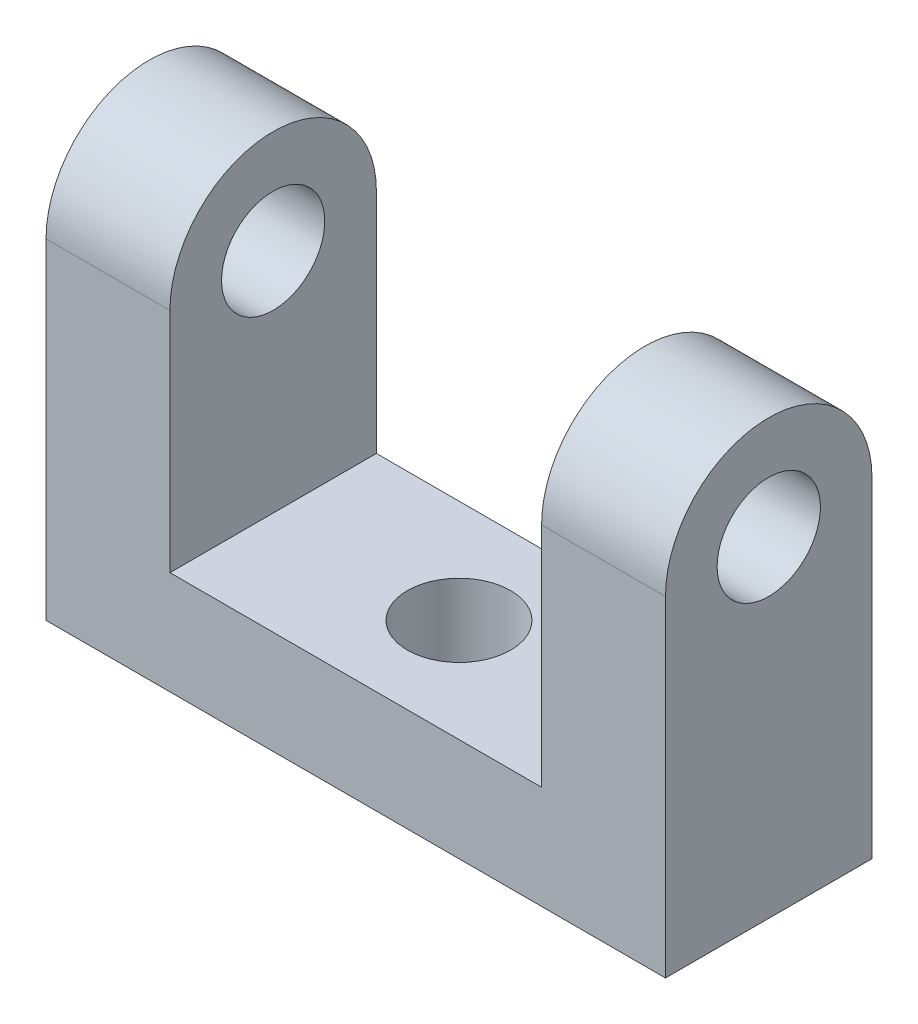
ISO-10303-21;
HEADER;
FILE_DESCRIPTION(('STEP AP214'),'2;1');
FILE_NAME('part.step','',(''),(''),'','','');
FILE_SCHEMA(('AUTOMOTIVE_DESIGN { 1 0 10303 214 1 1 1 1 }'));
ENDSEC;
DATA;
#1=APPLICATION_CONTEXT('core data for automotive mechanical design processes');
#2=APPLICATION_PROTOCOL_DEFINITION('international standard','automotive_design',2000,#1);
#3=PRODUCT_CONTEXT('',#1,'mechanical');
#4=PRODUCT('Part','Part','',(#3));
#5=PRODUCT_RELATED_PRODUCT_CATEGORY('part','',(#4));
#6=PRODUCT_DEFINITION_FORMATION('','',#4);
#7=PRODUCT_DEFINITION_CONTEXT('part definition',#1,'design');
#8=PRODUCT_DEFINITION('design','',#6,#7);
#9=PRODUCT_DEFINITION_SHAPE('','',#8);
#10=(LENGTH_UNIT() NAMED_UNIT(*) SI_UNIT(.MILLI.,.METRE.));
#11=(NAMED_UNIT(*) PLANE_ANGLE_UNIT() SI_UNIT($,.RADIAN.));
#12=(NAMED_UNIT(*) SI_UNIT($,.STERADIAN.) SOLID_ANGLE_UNIT());
#13=UNCERTAINTY_MEASURE_WITH_UNIT(LENGTH_MEASURE(1.E-05),#10,'distance_accuracy_value','');
#14=(GEOMETRIC_REPRESENTATION_CONTEXT(3) GLOBAL_UNCERTAINTY_ASSIGNED_CONTEXT((#13)) GLOBAL_UNIT_ASSIGNED_CONTEXT((#10,
#11,#12)) REPRESENTATION_CONTEXT('',''));
#15=CARTESIAN_POINT('',(0.,0.,0.));
#16=DIRECTION('',(0.,0.,1.));
#17=DIRECTION('',(1.,0.,0.));
#18=AXIS2_PLACEMENT_3D('',#15,#16,#17);
#19=CARTESIAN_POINT('',(38.1,20.32,0.));
#20=DIRECTION('',(-1.,0.,0.));
#21=DIRECTION('',(0.,0.,1.));
#22=AXIS2_PLACEMENT_3D('',#19,#20,#21);
#23=CYLINDRICAL_SURFACE('',#22,6.35);
#24=DIRECTION('',(-1.,0.,0.));
#25=VECTOR('',#24,1.);
#26=CARTESIAN_POINT('',(38.1,20.32,6.35));
#27=LINE('',#26,#25);
#28=CARTESIAN_POINT('',(7.62,20.32,6.35));
#29=VERTEX_POINT('',#28);
#30=CARTESIAN_POINT('',(0.,20.32,6.35));
#31=VERTEX_POINT('',#30);
#32=EDGE_CURVE('E171',#29,#31,#27,.T.);
#33=ORIENTED_EDGE('',*,*,#32,.F.);
#34=CARTESIAN_POINT('',(7.62,20.32,0.));
#35=DIRECTION('',(-1.,0.,0.));
#36=DIRECTION('',(0.,0.,1.));
#37=AXIS2_PLACEMENT_3D('',#34,#35,#36);
#38=CIRCLE('',#37,6.35);
#39=CARTESIAN_POINT('',(7.62,20.32,-6.35));
#40=VERTEX_POINT('',#39);
#41=EDGE_CURVE('E138',#29,#40,#38,.T.);
#42=ORIENTED_EDGE('',*,*,#41,.T.);
#43=DIRECTION('',(-1.,0.,0.));
#44=VECTOR('',#43,1.);
#45=CARTESIAN_POINT('',(38.1,20.32,-6.35));
#46=LINE('',#45,#44);
#47=CARTESIAN_POINT('',(0.,20.32,-6.35));
#48=VERTEX_POINT('',#47);
#49=EDGE_CURVE('E42',#40,#48,#46,.T.);
#50=ORIENTED_EDGE('',*,*,#49,.T.);
#51=CARTESIAN_POINT('',(0.,20.32,0.));
#52=DIRECTION('',(1.,0.,0.));
#53=DIRECTION('',(0.,0.,1.));
#54=AXIS2_PLACEMENT_3D('',#51,#52,#53);
#55=CIRCLE('',#54,6.35);
#56=EDGE_CURVE('E162',#48,#31,#55,.T.);
#57=ORIENTED_EDGE('',*,*,#56,.T.);
#58=EDGE_LOOP('',(#33,#42,#50,#57));
#59=FACE_BOUND('',#58,.T.);
#60=ADVANCED_FACE('F33',(#59),#23,.T.);
#61=CARTESIAN_POINT('',(38.1,20.32,0.));
#62=DIRECTION('',(-1.,0.,0.));
#63=DIRECTION('',(0.,0.,1.));
#64=AXIS2_PLACEMENT_3D('',#61,#62,#63);
#65=CYLINDRICAL_SURFACE('',#64,3.175);
#66=CARTESIAN_POINT('',(7.62,20.32,0.));
#67=DIRECTION('',(-1.,0.,0.));
#68=DIRECTION('',(0.,0.,1.));
#69=AXIS2_PLACEMENT_3D('',#66,#67,#68);
#70=CIRCLE('',#69,3.175);
#71=CARTESIAN_POINT('',(7.62000000000001,20.32,3.175));
#72=VERTEX_POINT('',#71);
#73=EDGE_CURVE('E37',#72,#72,#70,.T.);
#74=CARTESIAN_POINT('',(0.,20.32,0.));
#75=DIRECTION('',(1.,0.,0.));
#76=DIRECTION('',(0.,0.,-1.));
#77=AXIS2_PLACEMENT_3D('',#74,#75,#76);
#78=CIRCLE('',#77,3.175);
#79=CARTESIAN_POINT('',(0.,20.32,3.175));
#80=VERTEX_POINT('',#79);
#81=EDGE_CURVE('E146',#80,#80,#78,.T.);
#82=CARTESIAN_POINT('',(7.62000000000001,20.32,3.175));
#83=CARTESIAN_POINT('',(7.54062500000001,20.32,3.175));
#84=CARTESIAN_POINT('',(7.46125000000001,20.32,3.175));
#85=CARTESIAN_POINT('',(7.30250000000001,20.32,3.175));
#86=CARTESIAN_POINT('',(7.223125,20.32,3.175));
#87=CARTESIAN_POINT('',(7.064375,20.32,3.175));
#88=CARTESIAN_POINT('',(6.985,20.32,3.175));
#89=CARTESIAN_POINT('',(6.82625000000001,20.32,3.175));
#90=CARTESIAN_POINT('',(6.74687500000001,20.32,3.175));
#91=CARTESIAN_POINT('',(6.58812500000001,20.32,3.175));
#92=CARTESIAN_POINT('',(6.50875000000001,20.32,3.175));
#93=CARTESIAN_POINT('',(6.35000000000001,20.32,3.175));
#94=CARTESIAN_POINT('',(6.27062500000001,20.32,3.175));
#95=CARTESIAN_POINT('',(6.11187500000001,20.32,3.175));
#96=CARTESIAN_POINT('',(6.03250000000001,20.32,3.175));
#97=CARTESIAN_POINT('',(5.87375,20.32,3.175));
#98=CARTESIAN_POINT('',(5.794375,20.32,3.175));
#99=CARTESIAN_POINT('',(5.63562500000001,20.32,3.175));
#100=CARTESIAN_POINT('',(5.55625000000001,20.32,3.175));
#101=CARTESIAN_POINT('',(5.39750000000001,20.32,3.175));
#102=CARTESIAN_POINT('',(5.31812500000001,20.32,3.175));
#103=CARTESIAN_POINT('',(5.15937500000001,20.32,3.175));
#104=CARTESIAN_POINT('',(5.08000000000001,20.32,3.175));
#105=CARTESIAN_POINT('',(4.92125000000001,20.32,3.175));
#106=CARTESIAN_POINT('',(4.84187500000001,20.32,3.175));
#107=CARTESIAN_POINT('',(4.683125,20.32,3.175));
#108=CARTESIAN_POINT('',(4.60375,20.32,3.175));
#109=CARTESIAN_POINT('',(4.445,20.32,3.175));
#110=CARTESIAN_POINT('',(4.365625,20.32,3.175));
#111=CARTESIAN_POINT('',(4.20687500000001,20.32,3.175));
#112=CARTESIAN_POINT('',(4.12750000000001,20.32,3.175));
#113=CARTESIAN_POINT('',(3.96875000000001,20.32,3.175));
#114=CARTESIAN_POINT('',(3.88937500000001,20.32,3.175));
#115=CARTESIAN_POINT('',(3.73062500000001,20.32,3.175));
#116=CARTESIAN_POINT('',(3.65125,20.32,3.175));
#117=CARTESIAN_POINT('',(3.4925,20.32,3.175));
#118=CARTESIAN_POINT('',(3.413125,20.32,3.175));
#119=CARTESIAN_POINT('',(3.254375,20.32,3.175));
#120=CARTESIAN_POINT('',(3.175,20.32,3.175));
#121=CARTESIAN_POINT('',(3.01625000000001,20.32,3.175));
#122=CARTESIAN_POINT('',(2.93687500000001,20.32,3.175));
#123=CARTESIAN_POINT('',(2.778125,20.32,3.175));
#124=CARTESIAN_POINT('',(2.69875,20.32,3.175));
#125=CARTESIAN_POINT('',(2.54,20.32,3.175));
#126=CARTESIAN_POINT('',(2.460625,20.32,3.175));
#127=CARTESIAN_POINT('',(2.301875,20.32,3.175));
#128=CARTESIAN_POINT('',(2.2225,20.32,3.175));
#129=CARTESIAN_POINT('',(2.06375,20.32,3.175));
#130=CARTESIAN_POINT('',(1.984375,20.32,3.175));
#131=CARTESIAN_POINT('',(1.825625,20.32,3.175));
#132=CARTESIAN_POINT('',(1.74625,20.32,3.175));
#133=CARTESIAN_POINT('',(1.5875,20.32,3.175));
#134=CARTESIAN_POINT('',(1.508125,20.32,3.175));
#135=CARTESIAN_POINT('',(1.349375,20.32,3.175));
#136=CARTESIAN_POINT('',(1.27,20.32,3.175));
#137=CARTESIAN_POINT('',(1.11125,20.32,3.175));
#138=CARTESIAN_POINT('',(1.031875,20.32,3.175));
#139=CARTESIAN_POINT('',(0.873125000000002,20.32,3.175));
#140=CARTESIAN_POINT('',(0.793750000000003,20.32,3.175));
#141=CARTESIAN_POINT('',(0.635000000000001,20.32,3.175));
#142=CARTESIAN_POINT('',(0.555624999999999,20.32,3.175));
#143=CARTESIAN_POINT('',(0.396874999999998,20.32,3.175));
#144=CARTESIAN_POINT('',(0.317499999999998,20.32,3.175));
#145=CARTESIAN_POINT('',(0.158749999999999,20.32,3.175));
#146=CARTESIAN_POINT('',(0.0793749999999996,20.32,3.175));
#147=CARTESIAN_POINT('',(0.,20.32,3.175));
#148=B_SPLINE_CURVE_WITH_KNOTS('',3,(#82,#83,#84,#85,#86,#87,#88,#89,#90,#91,#92,#93,#94,#95,
#96,#97,#98,#99,#100,#101,#102,#103,#104,#105,#106,#107,#108,#109,#110,#111,#112,#113,#114,#115,
#116,#117,#118,#119,#120,#121,#122,#123,#124,#125,#126,#127,#128,#129,#130,#131,#132,#133,#134,
#135,#136,#137,#138,#139,#140,#141,#142,#143,#144,#145,#146,#147),.UNSPECIFIED.,.F.,.F.,(4,2,2,
2,2,2,2,2,2,2,2,2,2,2,2,2,2,2,2,2,2,2,2,2,2,2,2,2,2,2,2,2,4),(0.,0.238124999999999,
0.476250000000001,0.714375,0.952499999999998,1.190625,1.42875,1.666875,1.905,2.143125,2.38125,
2.619375,2.8575,3.095625,3.33375,3.571875,3.81,4.048125,4.28625,4.524375,4.7625,5.000625,
5.23875,5.476875,5.715,5.95312500000001,6.19125000000001,6.429375,6.6675,6.905625,
7.14375000000001,7.38187500000001,7.62000000000001),.UNSPECIFIED.);
#149=EDGE_CURVE('BSEAM181',#72,#80,#148,.T.);
#150=ORIENTED_EDGE('',*,*,#73,.F.);
#151=ORIENTED_EDGE('',*,*,#81,.F.);
#152=ORIENTED_EDGE('',*,*,#149,.T.);
#153=ORIENTED_EDGE('',*,*,#149,.F.);
#154=EDGE_LOOP('',(#150,#152,#151,#153));
#155=FACE_BOUND('',#154,.T.);
#156=ADVANCED_FACE('F181',(#155),#65,.F.);
#157=CARTESIAN_POINT('',(38.1,20.32,0.));
#158=DIRECTION('',(-1.,0.,0.));
#159=DIRECTION('',(0.,0.,1.));
#160=AXIS2_PLACEMENT_3D('',#157,#158,#159);
#161=PLANE('',#160);
#162=DIRECTION('',(0.,1.,0.));
#163=VECTOR('',#162,1.);
#164=CARTESIAN_POINT('',(38.1,0.,-6.35));
#165=LINE('',#164,#163);
#166=CARTESIAN_POINT('',(38.1,0.,-6.35));
#167=VERTEX_POINT('',#166);
#168=CARTESIAN_POINT('',(38.1,20.32,-6.35));
#169=VERTEX_POINT('',#168);
#170=EDGE_CURVE('E153',#167,#169,#165,.T.);
#171=ORIENTED_EDGE('',*,*,#170,.T.);
#172=CARTESIAN_POINT('',(38.1,20.32,0.));
#173=DIRECTION('',(1.,0.,0.));
#174=DIRECTION('',(0.,0.,1.));
#175=AXIS2_PLACEMENT_3D('',#172,#173,#174);
#176=CIRCLE('',#175,6.35);
#177=CARTESIAN_POINT('',(38.1,20.32,6.35));
#178=VERTEX_POINT('',#177);
#179=EDGE_CURVE('E87',#169,#178,#176,.T.);
#180=ORIENTED_EDGE('',*,*,#179,.T.);
#181=DIRECTION('',(0.,-1.,0.));
#182=VECTOR('',#181,1.);
#183=CARTESIAN_POINT('',(38.1,0.,6.35));
#184=LINE('',#183,#182);
#185=CARTESIAN_POINT('',(38.1,0.,6.35));
#186=VERTEX_POINT('',#185);
#187=EDGE_CURVE('E156',#178,#186,#184,.T.);
#188=ORIENTED_EDGE('',*,*,#187,.T.);
#189=DIRECTION('',(0.,0.,-1.));
#190=VECTOR('',#189,1.);
#191=CARTESIAN_POINT('',(38.1,0.,6.35));
#192=LINE('',#191,#190);
#193=EDGE_CURVE('E59',#186,#167,#192,.T.);
#194=ORIENTED_EDGE('',*,*,#193,.T.);
#195=EDGE_LOOP('',(#171,#180,#188,#194));
#196=FACE_BOUND('',#195,.T.);
#197=CARTESIAN_POINT('',(38.1,20.32,0.));
#198=DIRECTION('',(1.,0.,0.));
#199=DIRECTION('',(0.,0.,-1.));
#200=AXIS2_PLACEMENT_3D('',#197,#198,#199);
#201=CIRCLE('',#200,3.175);
#202=CARTESIAN_POINT('',(38.1,20.32,3.175));
#203=VERTEX_POINT('',#202);
#204=EDGE_CURVE('E147',#203,#203,#201,.T.);
#205=ORIENTED_EDGE('',*,*,#204,.F.);
#206=EDGE_LOOP('',(#205));
#207=FACE_BOUND('',#206,.T.);
#208=ADVANCED_FACE('F184',(#196,#207),#161,.F.);
#209=CARTESIAN_POINT('',(0.,20.32,0.));
#210=DIRECTION('',(-1.,0.,0.));
#211=DIRECTION('',(0.,0.,1.));
#212=AXIS2_PLACEMENT_3D('',#209,#210,#211);
#213=PLANE('',#212);
#214=DIRECTION('',(0.,1.,0.));
#215=VECTOR('',#214,1.);
#216=CARTESIAN_POINT('',(0.,0.,-6.35));
#217=LINE('',#216,#215);
#218=CARTESIAN_POINT('',(0.,0.,-6.35));
#219=VERTEX_POINT('',#218);
#220=EDGE_CURVE('E150',#219,#48,#217,.T.);
#221=ORIENTED_EDGE('',*,*,#220,.F.);
#222=DIRECTION('',(0.,0.,-1.));
#223=VECTOR('',#222,1.);
#224=CARTESIAN_POINT('',(0.,0.,6.35));
#225=LINE('',#224,#223);
#226=CARTESIAN_POINT('',(0.,0.,6.35));
#227=VERTEX_POINT('',#226);
#228=EDGE_CURVE('E80',#227,#219,#225,.T.);
#229=ORIENTED_EDGE('',*,*,#228,.F.);
#230=DIRECTION('',(0.,-1.,0.));
#231=VECTOR('',#230,1.);
#232=CARTESIAN_POINT('',(0.,0.,6.35));
#233=LINE('',#232,#231);
#234=EDGE_CURVE('E165',#31,#227,#233,.T.);
#235=ORIENTED_EDGE('',*,*,#234,.F.);
#236=ORIENTED_EDGE('',*,*,#56,.F.);
#237=EDGE_LOOP('',(#221,#229,#235,#236));
#238=FACE_BOUND('',#237,.T.);
#239=ORIENTED_EDGE('',*,*,#81,.T.);
#240=EDGE_LOOP('',(#239));
#241=FACE_BOUND('',#240,.T.);
#242=ADVANCED_FACE('F186',(#238,#241),#213,.T.);
#243=CARTESIAN_POINT('',(38.1,0.,-6.35));
#244=DIRECTION('',(0.,0.,1.));
#245=DIRECTION('',(1.,0.,0.));
#246=AXIS2_PLACEMENT_3D('',#243,#244,#245);
#247=PLANE('',#246);
#248=ORIENTED_EDGE('',*,*,#49,.F.);
#249=DIRECTION('',(0.,-1.,0.));
#250=VECTOR('',#249,1.);
#251=CARTESIAN_POINT('',(7.62,0.,-6.35));
#252=LINE('',#251,#250);
#253=CARTESIAN_POINT('',(7.62,6.35,-6.35));
#254=VERTEX_POINT('',#253);
#255=EDGE_CURVE('E141',#40,#254,#252,.T.);
#256=ORIENTED_EDGE('',*,*,#255,.T.);
#257=DIRECTION('',(1.,0.,0.));
#258=VECTOR('',#257,1.);
#259=CARTESIAN_POINT('',(38.1,6.35,-6.35));
#260=LINE('',#259,#258);
#261=CARTESIAN_POINT('',(30.48,6.35,-6.35));
#262=VERTEX_POINT('',#261);
#263=EDGE_CURVE('E144',#254,#262,#260,.T.);
#264=ORIENTED_EDGE('',*,*,#263,.T.);
#265=DIRECTION('',(0.,1.,0.));
#266=VECTOR('',#265,1.);
#267=CARTESIAN_POINT('',(30.48,0.,-6.35));
#268=LINE('',#267,#266);
#269=CARTESIAN_POINT('',(30.48,20.32,-6.35));
#270=VERTEX_POINT('',#269);
#271=EDGE_CURVE('E117',#262,#270,#268,.T.);
#272=ORIENTED_EDGE('',*,*,#271,.T.);
#273=EDGE_CURVE('E11',#169,#270,#46,.T.);
#274=ORIENTED_EDGE('',*,*,#273,.F.);
#275=ORIENTED_EDGE('',*,*,#170,.F.);
#276=DIRECTION('',(-1.,0.,0.));
#277=VECTOR('',#276,1.);
#278=CARTESIAN_POINT('',(38.1,0.,-6.35));
#279=LINE('',#278,#277);
#280=EDGE_CURVE('E159',#167,#219,#279,.T.);
#281=ORIENTED_EDGE('',*,*,#280,.T.);
#282=ORIENTED_EDGE('',*,*,#220,.T.);
#283=EDGE_LOOP('',(#248,#256,#264,#272,#274,#275,#281,#282));
#284=FACE_BOUND('',#283,.T.);
#285=ADVANCED_FACE('F35',(#284),#247,.F.);
#286=CARTESIAN_POINT('',(30.48,20.32,0.));
#287=DIRECTION('',(1.,0.,0.));
#288=DIRECTION('',(0.,1.,0.));
#289=AXIS2_PLACEMENT_3D('',#286,#287,#288);
#290=CIRCLE('',#289,6.35);
#291=CARTESIAN_POINT('',(30.48,20.32,6.35));
#292=VERTEX_POINT('',#291);
#293=EDGE_CURVE('E135',#270,#292,#290,.T.);
#294=ORIENTED_EDGE('',*,*,#293,.T.);
#295=EDGE_CURVE('E130',#178,#292,#27,.T.);
#296=ORIENTED_EDGE('',*,*,#295,.F.);
#297=ORIENTED_EDGE('',*,*,#179,.F.);
#298=ORIENTED_EDGE('',*,*,#273,.T.);
#299=EDGE_LOOP('',(#294,#296,#297,#298));
#300=FACE_BOUND('',#299,.T.);
#301=ADVANCED_FACE('F197',(#300),#23,.T.);
#302=CARTESIAN_POINT('',(38.1,0.,6.35));
#303=DIRECTION('',(0.,0.,-1.));
#304=DIRECTION('',(-1.,0.,0.));
#305=AXIS2_PLACEMENT_3D('',#302,#303,#304);
#306=PLANE('',#305);
#307=DIRECTION('',(1.,0.,0.));
#308=VECTOR('',#307,1.);
#309=CARTESIAN_POINT('',(7.62,6.35,6.35));
#310=LINE('',#309,#308);
#311=CARTESIAN_POINT('',(7.62,6.35,6.35));
#312=VERTEX_POINT('',#311);
#313=CARTESIAN_POINT('',(30.48,6.35,6.35));
#314=VERTEX_POINT('',#313);
#315=EDGE_CURVE('E124',#312,#314,#310,.T.);
#316=ORIENTED_EDGE('',*,*,#315,.F.);
#317=DIRECTION('',(0.,-1.,0.));
#318=VECTOR('',#317,1.);
#319=CARTESIAN_POINT('',(7.62,26.67,6.35));
#320=LINE('',#319,#318);
#321=EDGE_CURVE('E50',#29,#312,#320,.T.);
#322=ORIENTED_EDGE('',*,*,#321,.F.);
#323=ORIENTED_EDGE('',*,*,#32,.T.);
#324=ORIENTED_EDGE('',*,*,#234,.T.);
#325=DIRECTION('',(-1.,0.,0.));
#326=VECTOR('',#325,1.);
#327=CARTESIAN_POINT('',(38.1,0.,6.35));
#328=LINE('',#327,#326);
#329=EDGE_CURVE('E169',#186,#227,#328,.T.);
#330=ORIENTED_EDGE('',*,*,#329,.F.);
#331=ORIENTED_EDGE('',*,*,#187,.F.);
#332=ORIENTED_EDGE('',*,*,#295,.T.);
#333=DIRECTION('',(0.,1.,0.));
#334=VECTOR('',#333,1.);
#335=CARTESIAN_POINT('',(30.48,26.67,6.35));
#336=LINE('',#335,#334);
#337=EDGE_CURVE('E114',#314,#292,#336,.T.);
#338=ORIENTED_EDGE('',*,*,#337,.F.);
#339=EDGE_LOOP('',(#316,#322,#323,#324,#330,#331,#332,#338));
#340=FACE_BOUND('',#339,.T.);
#341=ADVANCED_FACE('F128',(#340),#306,.F.);
#342=CARTESIAN_POINT('',(38.1,0.,6.35));
#343=DIRECTION('',(0.,1.,0.));
#344=DIRECTION('',(0.,0.,1.));
#345=AXIS2_PLACEMENT_3D('',#342,#343,#344);
#346=PLANE('',#345);
#347=CARTESIAN_POINT('',(19.05,0.,0.));
#348=DIRECTION('',(0.,1.,0.));
#349=DIRECTION('',(0.,0.,1.));
#350=AXIS2_PLACEMENT_3D('',#347,#348,#349);
#351=CIRCLE('',#350,3.175);
#352=CARTESIAN_POINT('',(19.05,0.,3.175));
#353=VERTEX_POINT('',#352);
#354=EDGE_CURVE('E224',#353,#353,#351,.T.);
#355=ORIENTED_EDGE('',*,*,#354,.T.);
#356=EDGE_LOOP('',(#355));
#357=FACE_BOUND('',#356,.T.);
#358=ORIENTED_EDGE('',*,*,#228,.T.);
#359=ORIENTED_EDGE('',*,*,#280,.F.);
#360=ORIENTED_EDGE('',*,*,#193,.F.);
#361=ORIENTED_EDGE('',*,*,#329,.T.);
#362=EDGE_LOOP('',(#358,#359,#360,#361));
#363=FACE_BOUND('',#362,.T.);
#364=ADVANCED_FACE('F179',(#357,#363),#346,.F.);
#365=CARTESIAN_POINT('',(30.48,20.32,0.));
#366=DIRECTION('',(1.,0.,0.));
#367=DIRECTION('',(0.,1.,0.));
#368=AXIS2_PLACEMENT_3D('',#365,#366,#367);
#369=CIRCLE('',#368,3.175);
#370=CARTESIAN_POINT('',(30.48,20.32,3.175));
#371=VERTEX_POINT('',#370);
#372=EDGE_CURVE('E120',#371,#371,#369,.T.);
#373=CARTESIAN_POINT('',(30.48,20.32,3.175));
#374=CARTESIAN_POINT('',(30.559375,20.32,3.175));
#375=CARTESIAN_POINT('',(30.63875,20.32,3.175));
#376=CARTESIAN_POINT('',(30.7975,20.32,3.175));
#377=CARTESIAN_POINT('',(30.876875,20.32,3.175));
#378=CARTESIAN_POINT('',(31.035625,20.32,3.175));
#379=CARTESIAN_POINT('',(31.115,20.32,3.175));
#380=CARTESIAN_POINT('',(31.27375,20.32,3.175));
#381=CARTESIAN_POINT('',(31.353125,20.32,3.175));
#382=CARTESIAN_POINT('',(31.511875,20.32,3.175));
#383=CARTESIAN_POINT('',(31.59125,20.32,3.175));
#384=CARTESIAN_POINT('',(31.75,20.32,3.175));
#385=CARTESIAN_POINT('',(31.829375,20.32,3.175));
#386=CARTESIAN_POINT('',(31.988125,20.32,3.175));
#387=CARTESIAN_POINT('',(32.0675,20.32,3.175));
#388=CARTESIAN_POINT('',(32.22625,20.32,3.175));
#389=CARTESIAN_POINT('',(32.305625,20.32,3.175));
#390=CARTESIAN_POINT('',(32.464375,20.32,3.175));
#391=CARTESIAN_POINT('',(32.54375,20.32,3.175));
#392=CARTESIAN_POINT('',(32.7025,20.32,3.175));
#393=CARTESIAN_POINT('',(32.781875,20.32,3.175));
#394=CARTESIAN_POINT('',(32.940625,20.32,3.175));
#395=CARTESIAN_POINT('',(33.02,20.32,3.175));
#396=CARTESIAN_POINT('',(33.17875,20.32,3.175));
#397=CARTESIAN_POINT('',(33.258125,20.32,3.175));
#398=CARTESIAN_POINT('',(33.416875,20.32,3.175));
#399=CARTESIAN_POINT('',(33.49625,20.32,3.175));
#400=CARTESIAN_POINT('',(33.655,20.32,3.175));
#401=CARTESIAN_POINT('',(33.734375,20.32,3.175));
#402=CARTESIAN_POINT('',(33.893125,20.32,3.175));
#403=CARTESIAN_POINT('',(33.9725,20.32,3.175));
#404=CARTESIAN_POINT('',(34.13125,20.32,3.175));
#405=CARTESIAN_POINT('',(34.210625,20.32,3.175));
#406=CARTESIAN_POINT('',(34.369375,20.32,3.175));
#407=CARTESIAN_POINT('',(34.44875,20.32,3.175));
#408=CARTESIAN_POINT('',(34.6075,20.32,3.175));
#409=CARTESIAN_POINT('',(34.686875,20.32,3.175));
#410=CARTESIAN_POINT('',(34.845625,20.32,3.175));
#411=CARTESIAN_POINT('',(34.925,20.32,3.175));
#412=CARTESIAN_POINT('',(35.08375,20.32,3.175));
#413=CARTESIAN_POINT('',(35.163125,20.32,3.175));
#414=CARTESIAN_POINT('',(35.321875,20.32,3.175));
#415=CARTESIAN_POINT('',(35.40125,20.32,3.175));
#416=CARTESIAN_POINT('',(35.56,20.32,3.175));
#417=CARTESIAN_POINT('',(35.639375,20.32,3.175));
#418=CARTESIAN_POINT('',(35.798125,20.32,3.175));
#419=CARTESIAN_POINT('',(35.8775,20.32,3.175));
#420=CARTESIAN_POINT('',(36.03625,20.32,3.175));
#421=CARTESIAN_POINT('',(36.115625,20.32,3.175));
#422=CARTESIAN_POINT('',(36.274375,20.32,3.175));
#423=CARTESIAN_POINT('',(36.35375,20.32,3.175));
#424=CARTESIAN_POINT('',(36.5125,20.32,3.175));
#425=CARTESIAN_POINT('',(36.591875,20.32,3.175));
#426=CARTESIAN_POINT('',(36.750625,20.32,3.175));
#427=CARTESIAN_POINT('',(36.83,20.32,3.175));
#428=CARTESIAN_POINT('',(36.98875,20.32,3.175));
#429=CARTESIAN_POINT('',(37.068125,20.32,3.175));
#430=CARTESIAN_POINT('',(37.226875,20.32,3.175));
#431=CARTESIAN_POINT('',(37.30625,20.32,3.175));
#432=CARTESIAN_POINT('',(37.465,20.32,3.175));
#433=CARTESIAN_POINT('',(37.544375,20.32,3.175));
#434=CARTESIAN_POINT('',(37.703125,20.32,3.175));
#435=CARTESIAN_POINT('',(37.7825,20.32,3.175));
#436=CARTESIAN_POINT('',(37.94125,20.32,3.175));
#437=CARTESIAN_POINT('',(38.020625,20.32,3.175));
#438=CARTESIAN_POINT('',(38.1,20.32,3.175));
#439=B_SPLINE_CURVE_WITH_KNOTS('',3,(#373,#374,#375,#376,#377,#378,#379,#380,#381,#382,#383,
#384,#385,#386,#387,#388,#389,#390,#391,#392,#393,#394,#395,#396,#397,#398,#399,#400,#401,#402,
#403,#404,#405,#406,#407,#408,#409,#410,#411,#412,#413,#414,#415,#416,#417,#418,#419,#420,#421,
#422,#423,#424,#425,#426,#427,#428,#429,#430,#431,#432,#433,#434,#435,#436,#437,#438),
.UNSPECIFIED.,.F.,.F.,(4,2,2,2,2,2,2,2,2,2,2,2,2,2,2,2,2,2,2,2,2,2,2,2,2,2,2,2,2,2,2,2,4),(0.,
0.238124999999999,0.476250000000001,0.714375,0.952499999999998,1.190625,1.42875,1.666875,1.905,
2.143125,2.38125,2.619375,2.8575,3.095625,3.33375,3.571875,3.81,4.048125,4.28625,4.524375,
4.7625,5.000625,5.23875,5.476875,5.715,5.953125,6.19125,6.429375,6.6675,6.905625,7.14375,
7.381875,7.62000000000001),.UNSPECIFIED.);
#440=EDGE_CURVE('BSEAM176',#371,#203,#439,.T.);
#441=ORIENTED_EDGE('',*,*,#372,.F.);
#442=ORIENTED_EDGE('',*,*,#204,.T.);
#443=ORIENTED_EDGE('',*,*,#440,.T.);
#444=ORIENTED_EDGE('',*,*,#440,.F.);
#445=EDGE_LOOP('',(#441,#443,#442,#444));
#446=FACE_BOUND('',#445,.T.);
#447=ADVANCED_FACE('F176',(#446),#65,.F.);
#448=CARTESIAN_POINT('',(7.62,6.35,-19.05));
#449=DIRECTION('',(0.,-1.,0.));
#450=DIRECTION('',(1.,0.,0.));
#451=AXIS2_PLACEMENT_3D('',#448,#449,#450);
#452=PLANE('',#451);
#453=CARTESIAN_POINT('',(19.05,6.35,0.));
#454=DIRECTION('',(0.,1.,0.));
#455=DIRECTION('',(-1.,0.,0.));
#456=AXIS2_PLACEMENT_3D('',#453,#454,#455);
#457=CIRCLE('',#456,3.175);
#458=CARTESIAN_POINT('',(15.875,6.35,0.));
#459=VERTEX_POINT('',#458);
#460=EDGE_CURVE('E226',#459,#459,#457,.T.);
#461=ORIENTED_EDGE('',*,*,#460,.F.);
#462=EDGE_LOOP('',(#461));
#463=FACE_BOUND('',#462,.T.);
#464=DIRECTION('',(0.,0.,1.));
#465=VECTOR('',#464,1.);
#466=CARTESIAN_POINT('',(7.62,6.35,-19.05));
#467=LINE('',#466,#465);
#468=EDGE_CURVE('E121',#254,#312,#467,.T.);
#469=ORIENTED_EDGE('',*,*,#468,.T.);
#470=ORIENTED_EDGE('',*,*,#315,.T.);
#471=DIRECTION('',(0.,0.,1.));
#472=VECTOR('',#471,1.);
#473=CARTESIAN_POINT('',(30.48,6.35,-19.05));
#474=LINE('',#473,#472);
#475=EDGE_CURVE('E110',#262,#314,#474,.T.);
#476=ORIENTED_EDGE('',*,*,#475,.F.);
#477=ORIENTED_EDGE('',*,*,#263,.F.);
#478=EDGE_LOOP('',(#469,#470,#476,#477));
#479=FACE_BOUND('',#478,.T.);
#480=ADVANCED_FACE('F125',(#463,#479),#452,.F.);
#481=CARTESIAN_POINT('',(7.62,26.67,-19.05));
#482=DIRECTION('',(-1.,0.,0.));
#483=DIRECTION('',(0.,0.,1.));
#484=AXIS2_PLACEMENT_3D('',#481,#482,#483);
#485=PLANE('',#484);
#486=ORIENTED_EDGE('',*,*,#73,.T.);
#487=EDGE_LOOP('',(#486));
#488=FACE_BOUND('',#487,.T.);
#489=ORIENTED_EDGE('',*,*,#41,.F.);
#490=ORIENTED_EDGE('',*,*,#321,.T.);
#491=ORIENTED_EDGE('',*,*,#468,.F.);
#492=ORIENTED_EDGE('',*,*,#255,.F.);
#493=EDGE_LOOP('',(#489,#490,#491,#492));
#494=FACE_BOUND('',#493,.T.);
#495=ADVANCED_FACE('F211',(#488,#494),#485,.F.);
#496=CARTESIAN_POINT('',(30.48,26.67,-19.05));
#497=DIRECTION('',(1.,0.,0.));
#498=DIRECTION('',(0.,1.,0.));
#499=AXIS2_PLACEMENT_3D('',#496,#497,#498);
#500=PLANE('',#499);
#501=ORIENTED_EDGE('',*,*,#372,.T.);
#502=EDGE_LOOP('',(#501));
#503=FACE_BOUND('',#502,.T.);
#504=ORIENTED_EDGE('',*,*,#475,.T.);
#505=ORIENTED_EDGE('',*,*,#337,.T.);
#506=ORIENTED_EDGE('',*,*,#293,.F.);
#507=ORIENTED_EDGE('',*,*,#271,.F.);
#508=EDGE_LOOP('',(#504,#505,#506,#507));
#509=FACE_BOUND('',#508,.T.);
#510=ADVANCED_FACE('F112',(#503,#509),#500,.F.);
#511=CARTESIAN_POINT('',(19.05,-19.05,0.));
#512=DIRECTION('',(0.,1.,0.));
#513=DIRECTION('',(-1.,0.,0.));
#514=AXIS2_PLACEMENT_3D('',#511,#512,#513);
#515=CYLINDRICAL_SURFACE('',#514,3.175);
#516=ORIENTED_EDGE('',*,*,#460,.T.);
#517=EDGE_LOOP('',(#516));
#518=FACE_BOUND('',#517,.T.);
#519=ORIENTED_EDGE('',*,*,#354,.F.);
#520=EDGE_LOOP('',(#519));
#521=FACE_BOUND('',#520,.T.);
#522=ADVANCED_FACE('F232',(#518,#521),#515,.F.);
#523=CLOSED_SHELL('',(#60,#156,#208,#242,#285,#301,#341,#364,#447,#480,#495,#510,#522));
#524=MANIFOLD_SOLID_BREP('B2',#523);
#525=ADVANCED_BREP_SHAPE_REPRESENTATION('',(#18,#524),#14);
#526=SHAPE_DEFINITION_REPRESENTATION(#9,#525);
ENDSEC;
END-ISO-10303-21;
